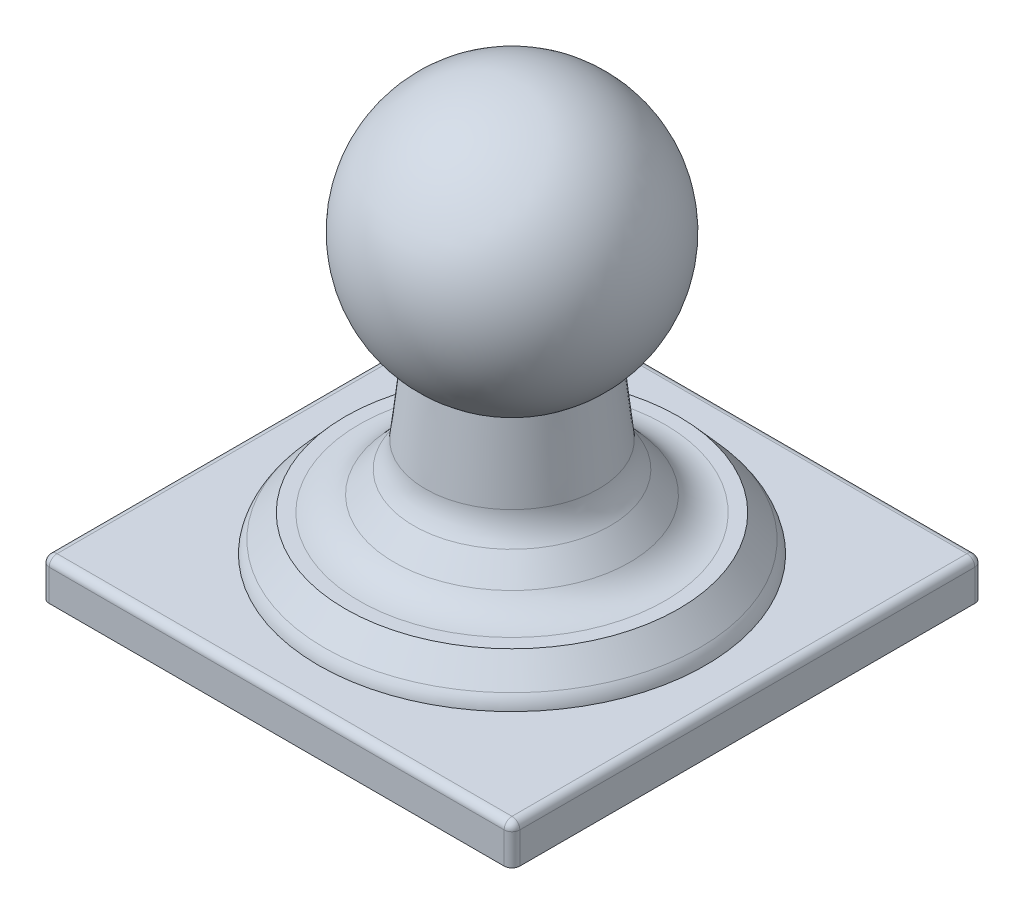
ISO-10303-21;
HEADER;
FILE_DESCRIPTION(('STEP AP214'),'2;1');
FILE_NAME('part.step','',(''),(''),'','','');
FILE_SCHEMA(('AUTOMOTIVE_DESIGN { 1 0 10303 214 1 1 1 1 }'));
ENDSEC;
DATA;
#1=APPLICATION_CONTEXT('core data for automotive mechanical design processes');
#2=APPLICATION_PROTOCOL_DEFINITION('international standard','automotive_design',2000,#1);
#3=PRODUCT_CONTEXT('',#1,'mechanical');
#4=PRODUCT('Part','Part','',(#3));
#5=PRODUCT_RELATED_PRODUCT_CATEGORY('part','',(#4));
#6=PRODUCT_DEFINITION_FORMATION('','',#4);
#7=PRODUCT_DEFINITION_CONTEXT('part definition',#1,'design');
#8=PRODUCT_DEFINITION('design','',#6,#7);
#9=PRODUCT_DEFINITION_SHAPE('','',#8);
#10=(LENGTH_UNIT() NAMED_UNIT(*) SI_UNIT(.MILLI.,.METRE.));
#11=(NAMED_UNIT(*) PLANE_ANGLE_UNIT() SI_UNIT($,.RADIAN.));
#12=(NAMED_UNIT(*) SI_UNIT($,.STERADIAN.) SOLID_ANGLE_UNIT());
#13=UNCERTAINTY_MEASURE_WITH_UNIT(LENGTH_MEASURE(1.E-05),#10,'distance_accuracy_value','');
#14=(GEOMETRIC_REPRESENTATION_CONTEXT(3) GLOBAL_UNCERTAINTY_ASSIGNED_CONTEXT((#13)) GLOBAL_UNIT_ASSIGNED_CONTEXT((#10,
#11,#12)) REPRESENTATION_CONTEXT('',''));
#15=CARTESIAN_POINT('',(0.,0.,0.));
#16=DIRECTION('',(0.,0.,1.));
#17=DIRECTION('',(1.,0.,0.));
#18=AXIS2_PLACEMENT_3D('',#15,#16,#17);
#19=CARTESIAN_POINT('',(0.,-12.3261705829112,0.));
#20=DIRECTION('',(0.,-1.,0.));
#21=DIRECTION('',(0.,0.,-1.));
#22=AXIS2_PLACEMENT_3D('',#19,#20,#21);
#23=TOROIDAL_SURFACE('',#22,10.9093,1.651);
#24=CARTESIAN_POINT('',(0.,-11.2287793924246,0.));
#25=DIRECTION('',(0.,1.,0.));
#26=DIRECTION('',(0.,0.,1.));
#27=AXIS2_PLACEMENT_3D('',#24,#25,#26);
#28=CIRCLE('',#27,12.1428045906046);
#29=CARTESIAN_POINT('',(0.,-11.2287793924246,12.1428045906046));
#30=VERTEX_POINT('',#29);
#31=EDGE_CURVE('E255',#30,#30,#28,.T.);
#32=ORIENTED_EDGE('',*,*,#31,.F.);
#33=EDGE_LOOP('',(#32));
#34=FACE_BOUND('',#33,.T.);
#35=CARTESIAN_POINT('',(0.,-12.0142,0.));
#36=DIRECTION('',(0.,-1.,0.));
#37=DIRECTION('',(0.,0.,-1.));
#38=AXIS2_PLACEMENT_3D('',#35,#36,#37);
#39=CIRCLE('',#38,12.5305573378085);
#40=CARTESIAN_POINT('',(0.,-12.0142,-12.5305573378086));
#41=VERTEX_POINT('',#40);
#42=EDGE_CURVE('E246',#41,#41,#39,.F.);
#43=ORIENTED_EDGE('',*,*,#42,.T.);
#44=EDGE_LOOP('',(#43));
#45=FACE_BOUND('',#44,.T.);
#46=ADVANCED_FACE('F39',(#34,#45),#23,.T.);
#47=CARTESIAN_POINT('',(0.,6.03885,0.));
#48=DIRECTION('',(0.,1.,0.));
#49=DIRECTION('',(0.,0.,-1.));
#50=AXIS2_PLACEMENT_3D('',#47,#48,#49);
#51=SPHERICAL_SURFACE('',#50,8.51535);
#52=CARTESIAN_POINT('',(0.,-0.795239963008974,0.));
#53=DIRECTION('',(0.,1.,0.));
#54=DIRECTION('',(0.,0.,1.));
#55=AXIS2_PLACEMENT_3D('',#52,#53,#54);
#56=CIRCLE('',#55,5.08);
#57=CARTESIAN_POINT('',(0.,-0.795239963008974,5.07999999999999));
#58=VERTEX_POINT('',#57);
#59=EDGE_CURVE('E251',#58,#58,#56,.T.);
#60=ORIENTED_EDGE('',*,*,#59,.T.);
#61=EDGE_LOOP('',(#60));
#62=FACE_BOUND('',#61,.T.);
#63=ADVANCED_FACE('F294',(#62),#51,.T.);
#64=CARTESIAN_POINT('',(0.,-6.54833996300897,0.));
#65=DIRECTION('',(0.,-1.,0.));
#66=DIRECTION('',(0.,0.,-1.));
#67=AXIS2_PLACEMENT_3D('',#64,#65,#66);
#68=CONICAL_SURFACE('',#67,5.715,0.109930301020858);
#69=CARTESIAN_POINT('',(0.,-5.58265198531798,0.));
#70=DIRECTION('',(0.,-1.,0.));
#71=DIRECTION('',(0.,0.,-1.));
#72=AXIS2_PLACEMENT_3D('',#69,#70,#71);
#73=CIRCLE('',#72,5.60841192299216);
#74=CARTESIAN_POINT('',(0.,-5.58265198531798,-5.60841192299217));
#75=VERTEX_POINT('',#74);
#76=EDGE_CURVE('E271',#75,#75,#73,.F.);
#77=ORIENTED_EDGE('',*,*,#76,.T.);
#78=EDGE_LOOP('',(#77));
#79=FACE_BOUND('',#78,.T.);
#80=ORIENTED_EDGE('',*,*,#59,.F.);
#81=EDGE_LOOP('',(#80));
#82=FACE_BOUND('',#81,.T.);
#83=ADVANCED_FACE('F300',(#79,#82),#68,.T.);
#84=CARTESIAN_POINT('',(0.,-9.71549999999999,0.));
#85=DIRECTION('',(0.,-1.,0.));
#86=DIRECTION('',(0.,0.,-1.));
#87=AXIS2_PLACEMENT_3D('',#84,#85,#86);
#88=CONICAL_SURFACE('',#87,8.53267376459578,0.727069086292868);
#89=CARTESIAN_POINT('',(0.,-8.69345296705206,0.));
#90=DIRECTION('',(0.,-1.,0.));
#91=DIRECTION('',(0.,0.,-1.));
#92=AXIS2_PLACEMENT_3D('',#89,#90,#91);
#93=CIRCLE('',#92,7.6234064470982);
#94=CARTESIAN_POINT('',(0.,-8.69345296705206,-7.62340644709821));
#95=VERTEX_POINT('',#94);
#96=EDGE_CURVE('E263',#95,#95,#93,.F.);
#97=ORIENTED_EDGE('',*,*,#96,.T.);
#98=EDGE_LOOP('',(#97));
#99=FACE_BOUND('',#98,.T.);
#100=CARTESIAN_POINT('',(0.,-7.27421185073774,0.));
#101=DIRECTION('',(0.,-1.,0.));
#102=DIRECTION('',(0.,0.,-1.));
#103=AXIS2_PLACEMENT_3D('',#100,#101,#102);
#104=CIRCLE('',#103,6.36077417958774);
#105=CARTESIAN_POINT('',(0.,-7.27421185073774,-6.36077417958775));
#106=VERTEX_POINT('',#105);
#107=EDGE_CURVE('E259',#106,#106,#104,.T.);
#108=ORIENTED_EDGE('',*,*,#107,.T.);
#109=EDGE_LOOP('',(#108));
#110=FACE_BOUND('',#109,.T.);
#111=ADVANCED_FACE('F398',(#99,#110),#88,.T.);
#112=CARTESIAN_POINT('',(0.,-9.7155,-8.53267376459578));
#113=DIRECTION('',(0.,-1.,0.));
#114=DIRECTION('',(0.,0.,-1.));
#115=AXIS2_PLACEMENT_3D('',#112,#113,#114);
#116=PLANE('',#115);
#117=CARTESIAN_POINT('',(0.,-9.7155,0.));
#118=DIRECTION('',(0.,-1.,0.));
#119=DIRECTION('',(0.,0.,-1.));
#120=AXIS2_PLACEMENT_3D('',#117,#118,#119);
#121=CIRCLE('',#120,9.90064569129125);
#122=CARTESIAN_POINT('',(0.,-9.7155,-9.90064569129126));
#123=VERTEX_POINT('',#122);
#124=EDGE_CURVE('E267',#123,#123,#121,.T.);
#125=ORIENTED_EDGE('',*,*,#124,.T.);
#126=EDGE_LOOP('',(#125));
#127=FACE_BOUND('',#126,.T.);
#128=CARTESIAN_POINT('',(0.,-9.71549999999999,0.));
#129=DIRECTION('',(0.,1.,0.));
#130=DIRECTION('',(0.,0.,1.));
#131=AXIS2_PLACEMENT_3D('',#128,#129,#130);
#132=CIRCLE('',#131,10.7965108786552);
#133=CARTESIAN_POINT('',(0.,-9.71549999999999,10.7965108786552));
#134=VERTEX_POINT('',#133);
#135=EDGE_CURVE('E247',#134,#134,#132,.T.);
#136=ORIENTED_EDGE('',*,*,#135,.T.);
#137=EDGE_LOOP('',(#136));
#138=FACE_BOUND('',#137,.T.);
#139=ADVANCED_FACE('F394',(#127,#138),#116,.F.);
#140=CARTESIAN_POINT('',(0.,-11.6980582680982,0.));
#141=DIRECTION('',(0.,-1.,0.));
#142=DIRECTION('',(0.,0.,-1.));
#143=AXIS2_PLACEMENT_3D('',#140,#141,#142);
#144=CONICAL_SURFACE('',#143,12.5603,0.727069086292868);
#145=ORIENTED_EDGE('',*,*,#31,.T.);
#146=EDGE_LOOP('',(#145));
#147=FACE_BOUND('',#146,.T.);
#148=ORIENTED_EDGE('',*,*,#135,.F.);
#149=EDGE_LOOP('',(#148));
#150=FACE_BOUND('',#149,.T.);
#151=ADVANCED_FACE('F310',(#147,#150),#144,.T.);
#152=CARTESIAN_POINT('',(0.,-6.66749999999999,0.));
#153=DIRECTION('',(0.,-1.,0.));
#154=DIRECTION('',(0.,0.,-1.));
#155=AXIS2_PLACEMENT_3D('',#152,#153,#154);
#156=TOROIDAL_SURFACE('',#155,9.90064569129125,3.048);
#157=ORIENTED_EDGE('',*,*,#124,.F.);
#158=EDGE_LOOP('',(#157));
#159=FACE_BOUND('',#158,.T.);
#160=ORIENTED_EDGE('',*,*,#96,.F.);
#161=EDGE_LOOP('',(#160));
#162=FACE_BOUND('',#161,.T.);
#163=ADVANCED_FACE('F306',(#159,#162),#156,.F.);
#164=CARTESIAN_POINT('',(0.,-5.24825888368568,0.));
#165=DIRECTION('',(0.,1.,0.));
#166=DIRECTION('',(0.,0.,1.));
#167=AXIS2_PLACEMENT_3D('',#164,#165,#166);
#168=TOROIDAL_SURFACE('',#167,8.63801342378079,3.048);
#169=ORIENTED_EDGE('',*,*,#107,.F.);
#170=EDGE_LOOP('',(#169));
#171=FACE_BOUND('',#170,.T.);
#172=ORIENTED_EDGE('',*,*,#76,.F.);
#173=EDGE_LOOP('',(#172));
#174=FACE_BOUND('',#173,.T.);
#175=ADVANCED_FACE('F309',(#171,#174),#168,.F.);
#176=CARTESIAN_POINT('',(-15.24,-12.0142,15.24));
#177=DIRECTION('',(-1.,0.,0.));
#178=DIRECTION('',(0.,0.,1.));
#179=AXIS2_PLACEMENT_3D('',#176,#177,#178);
#180=PLANE('',#179);
#181=DIRECTION('',(0.,0.,-1.));
#182=VECTOR('',#181,1.);
#183=CARTESIAN_POINT('',(-15.24,-12.5222,-15.24));
#184=LINE('',#183,#182);
#185=CARTESIAN_POINT('',(-15.24,-12.5222,14.732));
#186=VERTEX_POINT('',#185);
#187=CARTESIAN_POINT('',(-15.24,-12.5222,-14.732));
#188=VERTEX_POINT('',#187);
#189=EDGE_CURVE('E57',#186,#188,#184,.T.);
#190=ORIENTED_EDGE('',*,*,#189,.T.);
#191=DIRECTION('',(0.,-1.,0.));
#192=VECTOR('',#191,1.);
#193=CARTESIAN_POINT('',(-15.24,-12.0142,-14.732));
#194=LINE('',#193,#192);
#195=CARTESIAN_POINT('',(-15.24,-14.5542,-14.732));
#196=VERTEX_POINT('',#195);
#197=EDGE_CURVE('E182',#188,#196,#194,.T.);
#198=ORIENTED_EDGE('',*,*,#197,.T.);
#199=DIRECTION('',(0.,0.,-1.));
#200=VECTOR('',#199,1.);
#201=CARTESIAN_POINT('',(-15.24,-14.5542,15.24));
#202=LINE('',#201,#200);
#203=CARTESIAN_POINT('',(-15.24,-14.5542,14.732));
#204=VERTEX_POINT('',#203);
#205=EDGE_CURVE('E123',#204,#196,#202,.T.);
#206=ORIENTED_EDGE('',*,*,#205,.F.);
#207=DIRECTION('',(0.,-1.,0.));
#208=VECTOR('',#207,1.);
#209=CARTESIAN_POINT('',(-15.24,-12.0142,14.732));
#210=LINE('',#209,#208);
#211=EDGE_CURVE('E62',#204,#186,#210,.F.);
#212=ORIENTED_EDGE('',*,*,#211,.T.);
#213=EDGE_LOOP('',(#190,#198,#206,#212));
#214=FACE_BOUND('',#213,.T.);
#215=ADVANCED_FACE('F314',(#214),#180,.T.);
#216=CARTESIAN_POINT('',(-15.24,-12.0142,15.24));
#217=DIRECTION('',(0.,0.,1.));
#218=DIRECTION('',(1.,0.,0.));
#219=AXIS2_PLACEMENT_3D('',#216,#217,#218);
#220=PLANE('',#219);
#221=DIRECTION('',(-1.,0.,0.));
#222=VECTOR('',#221,1.);
#223=CARTESIAN_POINT('',(-15.24,-12.5222,15.24));
#224=LINE('',#223,#222);
#225=CARTESIAN_POINT('',(14.732,-12.5222,15.24));
#226=VERTEX_POINT('',#225);
#227=CARTESIAN_POINT('',(-14.732,-12.5222,15.24));
#228=VERTEX_POINT('',#227);
#229=EDGE_CURVE('E172',#226,#228,#224,.T.);
#230=ORIENTED_EDGE('',*,*,#229,.T.);
#231=DIRECTION('',(0.,-1.,0.));
#232=VECTOR('',#231,1.);
#233=CARTESIAN_POINT('',(-14.732,-12.0142,15.24));
#234=LINE('',#233,#232);
#235=CARTESIAN_POINT('',(-14.732,-14.5542,15.24));
#236=VERTEX_POINT('',#235);
#237=EDGE_CURVE('E175',#228,#236,#234,.T.);
#238=ORIENTED_EDGE('',*,*,#237,.T.);
#239=DIRECTION('',(-1.,0.,0.));
#240=VECTOR('',#239,1.);
#241=CARTESIAN_POINT('',(-15.24,-14.5542,15.24));
#242=LINE('',#241,#240);
#243=CARTESIAN_POINT('',(14.732,-14.5542,15.24));
#244=VERTEX_POINT('',#243);
#245=EDGE_CURVE('E242',#244,#236,#242,.T.);
#246=ORIENTED_EDGE('',*,*,#245,.F.);
#247=DIRECTION('',(0.,-1.,0.));
#248=VECTOR('',#247,1.);
#249=CARTESIAN_POINT('',(14.732,-12.0142,15.24));
#250=LINE('',#249,#248);
#251=EDGE_CURVE('E169',#244,#226,#250,.F.);
#252=ORIENTED_EDGE('',*,*,#251,.T.);
#253=EDGE_LOOP('',(#230,#238,#246,#252));
#254=FACE_BOUND('',#253,.T.);
#255=ADVANCED_FACE('F367',(#254),#220,.T.);
#256=CARTESIAN_POINT('',(15.24,-12.0142,15.24));
#257=DIRECTION('',(1.,0.,0.));
#258=DIRECTION('',(0.,0.,-1.));
#259=AXIS2_PLACEMENT_3D('',#256,#257,#258);
#260=PLANE('',#259);
#261=DIRECTION('',(0.,0.,1.));
#262=VECTOR('',#261,1.);
#263=CARTESIAN_POINT('',(15.24,-14.5542,15.24));
#264=LINE('',#263,#262);
#265=CARTESIAN_POINT('',(15.24,-14.5542,-14.732));
#266=VERTEX_POINT('',#265);
#267=CARTESIAN_POINT('',(15.24,-14.5542,14.732));
#268=VERTEX_POINT('',#267);
#269=EDGE_CURVE('E134',#266,#268,#264,.T.);
#270=ORIENTED_EDGE('',*,*,#269,.F.);
#271=DIRECTION('',(0.,-1.,0.));
#272=VECTOR('',#271,1.);
#273=CARTESIAN_POINT('',(15.24,-12.0142,-14.732));
#274=LINE('',#273,#272);
#275=CARTESIAN_POINT('',(15.24,-12.5222,-14.732));
#276=VERTEX_POINT('',#275);
#277=EDGE_CURVE('E166',#266,#276,#274,.F.);
#278=ORIENTED_EDGE('',*,*,#277,.T.);
#279=DIRECTION('',(0.,0.,1.));
#280=VECTOR('',#279,1.);
#281=CARTESIAN_POINT('',(15.24,-12.5222,15.24));
#282=LINE('',#281,#280);
#283=CARTESIAN_POINT('',(15.24,-12.5222,14.732));
#284=VERTEX_POINT('',#283);
#285=EDGE_CURVE('E163',#276,#284,#282,.T.);
#286=ORIENTED_EDGE('',*,*,#285,.T.);
#287=DIRECTION('',(0.,-1.,0.));
#288=VECTOR('',#287,1.);
#289=CARTESIAN_POINT('',(15.24,-12.0142,14.732));
#290=LINE('',#289,#288);
#291=EDGE_CURVE('E160',#284,#268,#290,.T.);
#292=ORIENTED_EDGE('',*,*,#291,.T.);
#293=EDGE_LOOP('',(#270,#278,#286,#292));
#294=FACE_BOUND('',#293,.T.);
#295=ADVANCED_FACE('F290',(#294),#260,.T.);
#296=CARTESIAN_POINT('',(-15.24,-12.0142,-15.24));
#297=DIRECTION('',(0.,0.,-1.));
#298=DIRECTION('',(-1.,0.,0.));
#299=AXIS2_PLACEMENT_3D('',#296,#297,#298);
#300=PLANE('',#299);
#301=DIRECTION('',(1.,0.,0.));
#302=VECTOR('',#301,1.);
#303=CARTESIAN_POINT('',(-15.24,-14.5542,-15.24));
#304=LINE('',#303,#302);
#305=CARTESIAN_POINT('',(-14.732,-14.5542,-15.24));
#306=VERTEX_POINT('',#305);
#307=CARTESIAN_POINT('',(14.732,-14.5542,-15.24));
#308=VERTEX_POINT('',#307);
#309=EDGE_CURVE('E121',#306,#308,#304,.T.);
#310=ORIENTED_EDGE('',*,*,#309,.F.);
#311=DIRECTION('',(0.,-1.,0.));
#312=VECTOR('',#311,1.);
#313=CARTESIAN_POINT('',(-14.732,-12.0142,-15.24));
#314=LINE('',#313,#312);
#315=CARTESIAN_POINT('',(-14.732,-12.5222,-15.24));
#316=VERTEX_POINT('',#315);
#317=EDGE_CURVE('E129',#306,#316,#314,.F.);
#318=ORIENTED_EDGE('',*,*,#317,.T.);
#319=DIRECTION('',(1.,0.,0.));
#320=VECTOR('',#319,1.);
#321=CARTESIAN_POINT('',(15.24,-12.5222,-15.24));
#322=LINE('',#321,#320);
#323=CARTESIAN_POINT('',(14.732,-12.5222,-15.24));
#324=VERTEX_POINT('',#323);
#325=EDGE_CURVE('E142',#316,#324,#322,.T.);
#326=ORIENTED_EDGE('',*,*,#325,.T.);
#327=DIRECTION('',(0.,-1.,0.));
#328=VECTOR('',#327,1.);
#329=CARTESIAN_POINT('',(14.732,-12.0142,-15.24));
#330=LINE('',#329,#328);
#331=EDGE_CURVE('E132',#324,#308,#330,.T.);
#332=ORIENTED_EDGE('',*,*,#331,.T.);
#333=EDGE_LOOP('',(#310,#318,#326,#332));
#334=FACE_BOUND('',#333,.T.);
#335=ADVANCED_FACE('F127',(#334),#300,.T.);
#336=CARTESIAN_POINT('',(0.,-12.0142,0.));
#337=DIRECTION('',(0.,-1.,0.));
#338=DIRECTION('',(0.,0.,-1.));
#339=AXIS2_PLACEMENT_3D('',#336,#337,#338);
#340=PLANE('',#339);
#341=DIRECTION('',(0.,0.,1.));
#342=VECTOR('',#341,1.);
#343=CARTESIAN_POINT('',(14.732,-12.0142,-15.24));
#344=LINE('',#343,#342);
#345=CARTESIAN_POINT('',(14.732,-12.0142,14.732));
#346=VERTEX_POINT('',#345);
#347=CARTESIAN_POINT('',(14.732,-12.0142,-14.732));
#348=VERTEX_POINT('',#347);
#349=EDGE_CURVE('E153',#346,#348,#344,.F.);
#350=ORIENTED_EDGE('',*,*,#349,.T.);
#351=DIRECTION('',(1.,0.,0.));
#352=VECTOR('',#351,1.);
#353=CARTESIAN_POINT('',(-15.24,-12.0142,-14.732));
#354=LINE('',#353,#352);
#355=CARTESIAN_POINT('',(-14.732,-12.0142,-14.732));
#356=VERTEX_POINT('',#355);
#357=EDGE_CURVE('E156',#348,#356,#354,.F.);
#358=ORIENTED_EDGE('',*,*,#357,.T.);
#359=DIRECTION('',(0.,0.,-1.));
#360=VECTOR('',#359,1.);
#361=CARTESIAN_POINT('',(-14.732,-12.0142,15.24));
#362=LINE('',#361,#360);
#363=CARTESIAN_POINT('',(-14.732,-12.0142,14.732));
#364=VERTEX_POINT('',#363);
#365=EDGE_CURVE('E141',#356,#364,#362,.F.);
#366=ORIENTED_EDGE('',*,*,#365,.T.);
#367=DIRECTION('',(-1.,0.,0.));
#368=VECTOR('',#367,1.);
#369=CARTESIAN_POINT('',(15.24,-12.0142,14.732));
#370=LINE('',#369,#368);
#371=EDGE_CURVE('E146',#364,#346,#370,.F.);
#372=ORIENTED_EDGE('',*,*,#371,.T.);
#373=EDGE_LOOP('',(#350,#358,#366,#372));
#374=FACE_BOUND('',#373,.T.);
#375=ORIENTED_EDGE('',*,*,#42,.F.);
#376=EDGE_LOOP('',(#375));
#377=FACE_BOUND('',#376,.T.);
#378=ADVANCED_FACE('F281',(#374,#377),#340,.F.);
#379=CARTESIAN_POINT('',(0.,-14.5542,-12.5603));
#380=DIRECTION('',(0.,1.,0.));
#381=DIRECTION('',(0.,0.,1.));
#382=AXIS2_PLACEMENT_3D('',#379,#380,#381);
#383=PLANE('',#382);
#384=ORIENTED_EDGE('',*,*,#205,.T.);
#385=CARTESIAN_POINT('',(-14.732,-14.5542,-14.732));
#386=DIRECTION('',(0.,1.,0.));
#387=DIRECTION('',(0.,0.,1.));
#388=AXIS2_PLACEMENT_3D('',#385,#386,#387);
#389=CIRCLE('',#388,0.508);
#390=EDGE_CURVE('E11',#196,#306,#389,.F.);
#391=ORIENTED_EDGE('',*,*,#390,.T.);
#392=ORIENTED_EDGE('',*,*,#309,.T.);
#393=CARTESIAN_POINT('',(14.732,-14.5542,-14.732));
#394=DIRECTION('',(0.,1.,0.));
#395=DIRECTION('',(0.,0.,1.));
#396=AXIS2_PLACEMENT_3D('',#393,#394,#395);
#397=CIRCLE('',#396,0.508);
#398=EDGE_CURVE('E188',#308,#266,#397,.F.);
#399=ORIENTED_EDGE('',*,*,#398,.T.);
#400=ORIENTED_EDGE('',*,*,#269,.T.);
#401=CARTESIAN_POINT('',(14.732,-14.5542,14.732));
#402=DIRECTION('',(0.,1.,0.));
#403=DIRECTION('',(0.,0.,1.));
#404=AXIS2_PLACEMENT_3D('',#401,#402,#403);
#405=CIRCLE('',#404,0.508);
#406=EDGE_CURVE('E185',#268,#244,#405,.F.);
#407=ORIENTED_EDGE('',*,*,#406,.T.);
#408=ORIENTED_EDGE('',*,*,#245,.T.);
#409=CARTESIAN_POINT('',(-14.732,-14.5542,14.732));
#410=DIRECTION('',(0.,1.,0.));
#411=DIRECTION('',(0.,0.,1.));
#412=AXIS2_PLACEMENT_3D('',#409,#410,#411);
#413=CIRCLE('',#412,0.508);
#414=EDGE_CURVE('E49',#236,#204,#413,.F.);
#415=ORIENTED_EDGE('',*,*,#414,.T.);
#416=EDGE_LOOP('',(#384,#391,#392,#399,#400,#407,#408,#415));
#417=FACE_BOUND('',#416,.T.);
#418=ADVANCED_FACE('F120',(#417),#383,.F.);
#419=CARTESIAN_POINT('',(-14.732,-12.0142,14.732));
#420=DIRECTION('',(0.,-1.,0.));
#421=DIRECTION('',(0.,0.,-1.));
#422=AXIS2_PLACEMENT_3D('',#419,#420,#421);
#423=CYLINDRICAL_SURFACE('',#422,0.508);
#424=ORIENTED_EDGE('',*,*,#414,.F.);
#425=ORIENTED_EDGE('',*,*,#237,.F.);
#426=CARTESIAN_POINT('',(-14.732,-12.5222,14.732));
#427=DIRECTION('',(0.,1.,0.));
#428=DIRECTION('',(0.,0.,1.));
#429=AXIS2_PLACEMENT_3D('',#426,#427,#428);
#430=CIRCLE('',#429,0.508);
#431=EDGE_CURVE('E228',#186,#228,#430,.T.);
#432=ORIENTED_EDGE('',*,*,#431,.F.);
#433=ORIENTED_EDGE('',*,*,#211,.F.);
#434=EDGE_LOOP('',(#424,#425,#432,#433));
#435=FACE_BOUND('',#434,.T.);
#436=ADVANCED_FACE('F41',(#435),#423,.T.);
#437=CARTESIAN_POINT('',(14.732,-12.0142,14.732));
#438=DIRECTION('',(0.,-1.,0.));
#439=DIRECTION('',(0.,0.,-1.));
#440=AXIS2_PLACEMENT_3D('',#437,#438,#439);
#441=CYLINDRICAL_SURFACE('',#440,0.508);
#442=ORIENTED_EDGE('',*,*,#406,.F.);
#443=ORIENTED_EDGE('',*,*,#291,.F.);
#444=CARTESIAN_POINT('',(14.732,-12.5222,14.732));
#445=DIRECTION('',(0.,1.,0.));
#446=DIRECTION('',(0.,0.,1.));
#447=AXIS2_PLACEMENT_3D('',#444,#445,#446);
#448=CIRCLE('',#447,0.508);
#449=EDGE_CURVE('E225',#226,#284,#448,.T.);
#450=ORIENTED_EDGE('',*,*,#449,.F.);
#451=ORIENTED_EDGE('',*,*,#251,.F.);
#452=EDGE_LOOP('',(#442,#443,#450,#451));
#453=FACE_BOUND('',#452,.T.);
#454=ADVANCED_FACE('F351',(#453),#441,.T.);
#455=CARTESIAN_POINT('',(-15.24,-12.5222,14.732));
#456=DIRECTION('',(1.,0.,0.));
#457=DIRECTION('',(0.,0.,-1.));
#458=AXIS2_PLACEMENT_3D('',#455,#456,#457);
#459=CYLINDRICAL_SURFACE('',#458,0.508);
#460=CARTESIAN_POINT('',(-14.732,-12.5222,14.732));
#461=DIRECTION('',(-1.,0.,0.));
#462=DIRECTION('',(0.,0.,1.));
#463=AXIS2_PLACEMENT_3D('',#460,#461,#462);
#464=CIRCLE('',#463,0.508);
#465=EDGE_CURVE('E43',#228,#364,#464,.T.);
#466=ORIENTED_EDGE('',*,*,#465,.F.);
#467=ORIENTED_EDGE('',*,*,#229,.F.);
#468=CARTESIAN_POINT('',(14.732,-12.5222,14.732));
#469=DIRECTION('',(1.,0.,0.));
#470=DIRECTION('',(0.,0.,-1.));
#471=AXIS2_PLACEMENT_3D('',#468,#469,#470);
#472=CIRCLE('',#471,0.508);
#473=EDGE_CURVE('E221',#346,#226,#472,.T.);
#474=ORIENTED_EDGE('',*,*,#473,.F.);
#475=ORIENTED_EDGE('',*,*,#371,.F.);
#476=EDGE_LOOP('',(#466,#467,#474,#475));
#477=FACE_BOUND('',#476,.T.);
#478=ADVANCED_FACE('F349',(#477),#459,.T.);
#479=CARTESIAN_POINT('',(-14.732,-12.5222,14.732));
#480=DIRECTION('',(0.,0.,1.));
#481=DIRECTION('',(1.,0.,0.));
#482=AXIS2_PLACEMENT_3D('',#479,#480,#481);
#483=SPHERICAL_SURFACE('',#482,0.508);
#484=ORIENTED_EDGE('',*,*,#431,.T.);
#485=ORIENTED_EDGE('',*,*,#465,.T.);
#486=CARTESIAN_POINT('',(-14.732,-12.5222,14.732));
#487=DIRECTION('',(0.,0.,1.));
#488=DIRECTION('',(1.,0.,0.));
#489=AXIS2_PLACEMENT_3D('',#486,#487,#488);
#490=CIRCLE('',#489,0.508);
#491=EDGE_CURVE('E217',#186,#364,#490,.F.);
#492=ORIENTED_EDGE('',*,*,#491,.F.);
#493=EDGE_LOOP('',(#484,#485,#492));
#494=FACE_BOUND('',#493,.T.);
#495=ADVANCED_FACE('F345',(#494),#483,.T.);
#496=CARTESIAN_POINT('',(14.732,-12.5222,14.732));
#497=DIRECTION('',(0.,0.,1.));
#498=DIRECTION('',(1.,0.,0.));
#499=AXIS2_PLACEMENT_3D('',#496,#497,#498);
#500=SPHERICAL_SURFACE('',#499,0.508);
#501=ORIENTED_EDGE('',*,*,#473,.T.);
#502=ORIENTED_EDGE('',*,*,#449,.T.);
#503=CARTESIAN_POINT('',(14.732,-12.5222,14.732));
#504=DIRECTION('',(0.,0.,1.));
#505=DIRECTION('',(1.,0.,0.));
#506=AXIS2_PLACEMENT_3D('',#503,#504,#505);
#507=CIRCLE('',#506,0.508);
#508=EDGE_CURVE('E213',#346,#284,#507,.F.);
#509=ORIENTED_EDGE('',*,*,#508,.F.);
#510=EDGE_LOOP('',(#501,#502,#509));
#511=FACE_BOUND('',#510,.T.);
#512=ADVANCED_FACE('F341',(#511),#500,.T.);
#513=CARTESIAN_POINT('',(-14.732,-12.5222,15.24));
#514=DIRECTION('',(0.,0.,1.));
#515=DIRECTION('',(1.,0.,0.));
#516=AXIS2_PLACEMENT_3D('',#513,#514,#515);
#517=CYLINDRICAL_SURFACE('',#516,0.508);
#518=ORIENTED_EDGE('',*,*,#491,.T.);
#519=ORIENTED_EDGE('',*,*,#365,.F.);
#520=CARTESIAN_POINT('',(-14.732,-12.5222,-14.732));
#521=DIRECTION('',(0.,0.,-1.));
#522=DIRECTION('',(0.,1.,0.));
#523=AXIS2_PLACEMENT_3D('',#520,#521,#522);
#524=CIRCLE('',#523,0.508);
#525=EDGE_CURVE('E209',#188,#356,#524,.T.);
#526=ORIENTED_EDGE('',*,*,#525,.F.);
#527=ORIENTED_EDGE('',*,*,#189,.F.);
#528=EDGE_LOOP('',(#518,#519,#526,#527));
#529=FACE_BOUND('',#528,.T.);
#530=ADVANCED_FACE('F338',(#529),#517,.T.);
#531=CARTESIAN_POINT('',(-14.732,-12.0142,-14.732));
#532=DIRECTION('',(0.,-1.,0.));
#533=DIRECTION('',(0.,0.,-1.));
#534=AXIS2_PLACEMENT_3D('',#531,#532,#533);
#535=CYLINDRICAL_SURFACE('',#534,0.508);
#536=ORIENTED_EDGE('',*,*,#390,.F.);
#537=ORIENTED_EDGE('',*,*,#197,.F.);
#538=CARTESIAN_POINT('',(-14.732,-12.5222,-14.732));
#539=DIRECTION('',(0.,1.,0.));
#540=DIRECTION('',(0.,0.,1.));
#541=AXIS2_PLACEMENT_3D('',#538,#539,#540);
#542=CIRCLE('',#541,0.508);
#543=EDGE_CURVE('E138',#316,#188,#542,.T.);
#544=ORIENTED_EDGE('',*,*,#543,.F.);
#545=ORIENTED_EDGE('',*,*,#317,.F.);
#546=EDGE_LOOP('',(#536,#537,#544,#545));
#547=FACE_BOUND('',#546,.T.);
#548=ADVANCED_FACE('F136',(#547),#535,.T.);
#549=CARTESIAN_POINT('',(14.732,-12.0142,-14.732));
#550=DIRECTION('',(0.,-1.,0.));
#551=DIRECTION('',(0.,0.,-1.));
#552=AXIS2_PLACEMENT_3D('',#549,#550,#551);
#553=CYLINDRICAL_SURFACE('',#552,0.508);
#554=ORIENTED_EDGE('',*,*,#398,.F.);
#555=ORIENTED_EDGE('',*,*,#331,.F.);
#556=CARTESIAN_POINT('',(14.732,-12.5222,-14.732));
#557=DIRECTION('',(0.,1.,0.));
#558=DIRECTION('',(0.,0.,1.));
#559=AXIS2_PLACEMENT_3D('',#556,#557,#558);
#560=CIRCLE('',#559,0.508);
#561=EDGE_CURVE('E203',#276,#324,#560,.T.);
#562=ORIENTED_EDGE('',*,*,#561,.F.);
#563=ORIENTED_EDGE('',*,*,#277,.F.);
#564=EDGE_LOOP('',(#554,#555,#562,#563));
#565=FACE_BOUND('',#564,.T.);
#566=ADVANCED_FACE('F331',(#565),#553,.T.);
#567=CARTESIAN_POINT('',(14.732,-12.5222,15.24));
#568=DIRECTION('',(0.,0.,-1.));
#569=DIRECTION('',(-1.,0.,0.));
#570=AXIS2_PLACEMENT_3D('',#567,#568,#569);
#571=CYLINDRICAL_SURFACE('',#570,0.508);
#572=ORIENTED_EDGE('',*,*,#508,.T.);
#573=ORIENTED_EDGE('',*,*,#285,.F.);
#574=CARTESIAN_POINT('',(14.732,-12.5222,-14.732));
#575=DIRECTION('',(0.,0.,-1.));
#576=DIRECTION('',(-1.,0.,0.));
#577=AXIS2_PLACEMENT_3D('',#574,#575,#576);
#578=CIRCLE('',#577,0.508);
#579=EDGE_CURVE('E199',#348,#276,#578,.T.);
#580=ORIENTED_EDGE('',*,*,#579,.F.);
#581=ORIENTED_EDGE('',*,*,#349,.F.);
#582=EDGE_LOOP('',(#572,#573,#580,#581));
#583=FACE_BOUND('',#582,.T.);
#584=ADVANCED_FACE('F327',(#583),#571,.T.);
#585=CARTESIAN_POINT('',(-14.732,-12.5222,-14.732));
#586=DIRECTION('',(0.,0.,1.));
#587=DIRECTION('',(1.,0.,0.));
#588=AXIS2_PLACEMENT_3D('',#585,#586,#587);
#589=SPHERICAL_SURFACE('',#588,0.508);
#590=ORIENTED_EDGE('',*,*,#543,.T.);
#591=ORIENTED_EDGE('',*,*,#525,.T.);
#592=CARTESIAN_POINT('',(-14.732,-12.5222,-14.732));
#593=DIRECTION('',(-1.,0.,0.));
#594=DIRECTION('',(0.,0.,1.));
#595=AXIS2_PLACEMENT_3D('',#592,#593,#594);
#596=CIRCLE('',#595,0.508);
#597=EDGE_CURVE('E196',#316,#356,#596,.F.);
#598=ORIENTED_EDGE('',*,*,#597,.F.);
#599=EDGE_LOOP('',(#590,#591,#598));
#600=FACE_BOUND('',#599,.T.);
#601=ADVANCED_FACE('F323',(#600),#589,.T.);
#602=CARTESIAN_POINT('',(14.732,-12.5222,-14.732));
#603=DIRECTION('',(0.,0.,1.));
#604=DIRECTION('',(1.,0.,0.));
#605=AXIS2_PLACEMENT_3D('',#602,#603,#604);
#606=SPHERICAL_SURFACE('',#605,0.508);
#607=ORIENTED_EDGE('',*,*,#579,.T.);
#608=ORIENTED_EDGE('',*,*,#561,.T.);
#609=CARTESIAN_POINT('',(14.732,-12.5222,-14.732));
#610=DIRECTION('',(1.,0.,0.));
#611=DIRECTION('',(0.,1.,0.));
#612=AXIS2_PLACEMENT_3D('',#609,#610,#611);
#613=CIRCLE('',#612,0.508);
#614=EDGE_CURVE('E193',#348,#324,#613,.F.);
#615=ORIENTED_EDGE('',*,*,#614,.F.);
#616=EDGE_LOOP('',(#607,#608,#615));
#617=FACE_BOUND('',#616,.T.);
#618=ADVANCED_FACE('F319',(#617),#606,.T.);
#619=CARTESIAN_POINT('',(-15.24,-12.5222,-14.732));
#620=DIRECTION('',(-1.,0.,0.));
#621=DIRECTION('',(0.,0.,1.));
#622=AXIS2_PLACEMENT_3D('',#619,#620,#621);
#623=CYLINDRICAL_SURFACE('',#622,0.508);
#624=ORIENTED_EDGE('',*,*,#597,.T.);
#625=ORIENTED_EDGE('',*,*,#357,.F.);
#626=ORIENTED_EDGE('',*,*,#614,.T.);
#627=ORIENTED_EDGE('',*,*,#325,.F.);
#628=EDGE_LOOP('',(#624,#625,#626,#627));
#629=FACE_BOUND('',#628,.T.);
#630=ADVANCED_FACE('F316',(#629),#623,.T.);
#631=CLOSED_SHELL('',(#46,#63,#83,#111,#139,#151,#163,#175,#215,#255,#295,#335,#378,#418,#436,
#454,#478,#495,#512,#530,#548,#566,#584,#601,#618,#630));
#632=MANIFOLD_SOLID_BREP('B2',#631);
#633=ADVANCED_BREP_SHAPE_REPRESENTATION('',(#18,#632),#14);
#634=SHAPE_DEFINITION_REPRESENTATION(#9,#633);
ENDSEC;
END-ISO-10303-21;
